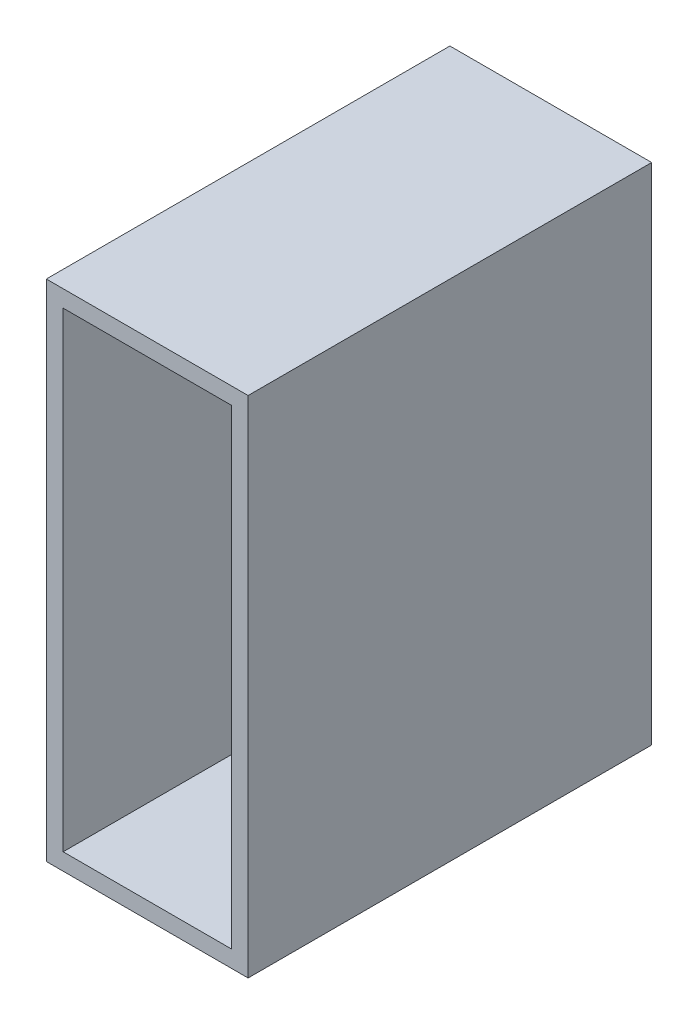
ISO-10303-21;
HEADER;
FILE_DESCRIPTION(('STEP AP214'),'2;1');
FILE_NAME('part.step','',(''),(''),'','','');
FILE_SCHEMA(('AUTOMOTIVE_DESIGN { 1 0 10303 214 1 1 1 1 }'));
ENDSEC;
DATA;
#1=APPLICATION_CONTEXT('core data for automotive mechanical design processes');
#2=APPLICATION_PROTOCOL_DEFINITION('international standard','automotive_design',2000,#1);
#3=PRODUCT_CONTEXT('',#1,'mechanical');
#4=PRODUCT('Part','Part','',(#3));
#5=PRODUCT_RELATED_PRODUCT_CATEGORY('part','',(#4));
#6=PRODUCT_DEFINITION_FORMATION('','',#4);
#7=PRODUCT_DEFINITION_CONTEXT('part definition',#1,'design');
#8=PRODUCT_DEFINITION('design','',#6,#7);
#9=PRODUCT_DEFINITION_SHAPE('','',#8);
#10=(LENGTH_UNIT() NAMED_UNIT(*) SI_UNIT(.MILLI.,.METRE.));
#11=(NAMED_UNIT(*) PLANE_ANGLE_UNIT() SI_UNIT($,.RADIAN.));
#12=(NAMED_UNIT(*) SI_UNIT($,.STERADIAN.) SOLID_ANGLE_UNIT());
#13=UNCERTAINTY_MEASURE_WITH_UNIT(LENGTH_MEASURE(1.E-05),#10,'distance_accuracy_value','');
#14=(GEOMETRIC_REPRESENTATION_CONTEXT(3) GLOBAL_UNCERTAINTY_ASSIGNED_CONTEXT((#13)) GLOBAL_UNIT_ASSIGNED_CONTEXT((#10,
#11,#12)) REPRESENTATION_CONTEXT('',''));
#15=CARTESIAN_POINT('',(0.,0.,0.));
#16=DIRECTION('',(0.,0.,1.));
#17=DIRECTION('',(1.,0.,0.));
#18=AXIS2_PLACEMENT_3D('',#15,#16,#17);
#19=CARTESIAN_POINT('',(0.,0.,48.));
#20=DIRECTION('',(0.,0.,-1.));
#21=DIRECTION('',(-1.,0.,0.));
#22=AXIS2_PLACEMENT_3D('',#19,#20,#21);
#23=PLANE('',#22);
#24=DIRECTION('',(0.,-1.,0.));
#25=VECTOR('',#24,1.);
#26=CARTESIAN_POINT('',(0.,0.,48.));
#27=LINE('',#26,#25);
#28=CARTESIAN_POINT('',(0.,60.,48.));
#29=VERTEX_POINT('',#28);
#30=CARTESIAN_POINT('',(0.,0.,48.));
#31=VERTEX_POINT('',#30);
#32=EDGE_CURVE('E144',#29,#31,#27,.T.);
#33=ORIENTED_EDGE('',*,*,#32,.T.);
#34=DIRECTION('',(1.,0.,0.));
#35=VECTOR('',#34,1.);
#36=CARTESIAN_POINT('',(0.,0.,48.));
#37=LINE('',#36,#35);
#38=CARTESIAN_POINT('',(24.,0.,48.));
#39=VERTEX_POINT('',#38);
#40=EDGE_CURVE('E146',#31,#39,#37,.T.);
#41=ORIENTED_EDGE('',*,*,#40,.T.);
#42=DIRECTION('',(0.,1.,0.));
#43=VECTOR('',#42,1.);
#44=CARTESIAN_POINT('',(24.,0.,48.));
#45=LINE('',#44,#43);
#46=CARTESIAN_POINT('',(24.,60.,48.));
#47=VERTEX_POINT('',#46);
#48=EDGE_CURVE('E151',#39,#47,#45,.T.);
#49=ORIENTED_EDGE('',*,*,#48,.T.);
#50=DIRECTION('',(-1.,0.,0.));
#51=VECTOR('',#50,1.);
#52=CARTESIAN_POINT('',(0.,60.,48.));
#53=LINE('',#52,#51);
#54=EDGE_CURVE('E153',#47,#29,#53,.T.);
#55=ORIENTED_EDGE('',*,*,#54,.T.);
#56=EDGE_LOOP('',(#33,#41,#49,#55));
#57=FACE_BOUND('',#56,.T.);
#58=DIRECTION('',(0.,-1.,0.));
#59=VECTOR('',#58,1.);
#60=CARTESIAN_POINT('',(2.,2.,48.));
#61=LINE('',#60,#59);
#62=CARTESIAN_POINT('',(2.,58.,48.));
#63=VERTEX_POINT('',#62);
#64=CARTESIAN_POINT('',(2.,2.,48.));
#65=VERTEX_POINT('',#64);
#66=EDGE_CURVE('E126',#63,#65,#61,.T.);
#67=ORIENTED_EDGE('',*,*,#66,.F.);
#68=DIRECTION('',(-1.,0.,0.));
#69=VECTOR('',#68,1.);
#70=CARTESIAN_POINT('',(2.,58.,48.));
#71=LINE('',#70,#69);
#72=CARTESIAN_POINT('',(22.,58.,48.));
#73=VERTEX_POINT('',#72);
#74=EDGE_CURVE('E117',#73,#63,#71,.T.);
#75=ORIENTED_EDGE('',*,*,#74,.F.);
#76=DIRECTION('',(0.,1.,0.));
#77=VECTOR('',#76,1.);
#78=CARTESIAN_POINT('',(22.,2.,48.));
#79=LINE('',#78,#77);
#80=CARTESIAN_POINT('',(22.,2.,48.));
#81=VERTEX_POINT('',#80);
#82=EDGE_CURVE('E137',#81,#73,#79,.T.);
#83=ORIENTED_EDGE('',*,*,#82,.F.);
#84=DIRECTION('',(1.,0.,0.));
#85=VECTOR('',#84,1.);
#86=CARTESIAN_POINT('',(2.,2.,48.));
#87=LINE('',#86,#85);
#88=EDGE_CURVE('E128',#65,#81,#87,.T.);
#89=ORIENTED_EDGE('',*,*,#88,.F.);
#90=EDGE_LOOP('',(#67,#75,#83,#89));
#91=FACE_BOUND('',#90,.T.);
#92=ADVANCED_FACE('F43',(#57,#91),#23,.F.);
#93=CARTESIAN_POINT('',(0.,0.,0.));
#94=DIRECTION('',(0.,0.,-1.));
#95=DIRECTION('',(-1.,0.,0.));
#96=AXIS2_PLACEMENT_3D('',#93,#94,#95);
#97=PLANE('',#96);
#98=DIRECTION('',(0.,-1.,0.));
#99=VECTOR('',#98,1.);
#100=CARTESIAN_POINT('',(0.,0.,0.));
#101=LINE('',#100,#99);
#102=CARTESIAN_POINT('',(0.,60.,0.));
#103=VERTEX_POINT('',#102);
#104=CARTESIAN_POINT('',(0.,0.,0.));
#105=VERTEX_POINT('',#104);
#106=EDGE_CURVE('E145',#103,#105,#101,.T.);
#107=ORIENTED_EDGE('',*,*,#106,.F.);
#108=DIRECTION('',(-1.,0.,0.));
#109=VECTOR('',#108,1.);
#110=CARTESIAN_POINT('',(0.,60.,0.));
#111=LINE('',#110,#109);
#112=CARTESIAN_POINT('',(24.,60.,0.));
#113=VERTEX_POINT('',#112);
#114=EDGE_CURVE('E149',#113,#103,#111,.T.);
#115=ORIENTED_EDGE('',*,*,#114,.F.);
#116=DIRECTION('',(0.,1.,0.));
#117=VECTOR('',#116,1.);
#118=CARTESIAN_POINT('',(24.,0.,0.));
#119=LINE('',#118,#117);
#120=CARTESIAN_POINT('',(24.,0.,0.));
#121=VERTEX_POINT('',#120);
#122=EDGE_CURVE('E159',#121,#113,#119,.T.);
#123=ORIENTED_EDGE('',*,*,#122,.F.);
#124=DIRECTION('',(1.,0.,0.));
#125=VECTOR('',#124,1.);
#126=CARTESIAN_POINT('',(0.,0.,0.));
#127=LINE('',#126,#125);
#128=EDGE_CURVE('E158',#105,#121,#127,.T.);
#129=ORIENTED_EDGE('',*,*,#128,.F.);
#130=EDGE_LOOP('',(#107,#115,#123,#129));
#131=FACE_BOUND('',#130,.T.);
#132=ADVANCED_FACE('F180',(#131),#97,.T.);
#133=CARTESIAN_POINT('',(0.,0.,48.));
#134=DIRECTION('',(1.,0.,0.));
#135=DIRECTION('',(0.,0.,-1.));
#136=AXIS2_PLACEMENT_3D('',#133,#134,#135);
#137=PLANE('',#136);
#138=ORIENTED_EDGE('',*,*,#106,.T.);
#139=DIRECTION('',(0.,0.,-1.));
#140=VECTOR('',#139,1.);
#141=CARTESIAN_POINT('',(0.,0.,48.));
#142=LINE('',#141,#140);
#143=EDGE_CURVE('E11',#31,#105,#142,.T.);
#144=ORIENTED_EDGE('',*,*,#143,.F.);
#145=ORIENTED_EDGE('',*,*,#32,.F.);
#146=DIRECTION('',(0.,0.,-1.));
#147=VECTOR('',#146,1.);
#148=CARTESIAN_POINT('',(0.,60.,48.));
#149=LINE('',#148,#147);
#150=EDGE_CURVE('E154',#29,#103,#149,.T.);
#151=ORIENTED_EDGE('',*,*,#150,.T.);
#152=EDGE_LOOP('',(#138,#144,#145,#151));
#153=FACE_BOUND('',#152,.T.);
#154=ADVANCED_FACE('F44',(#153),#137,.F.);
#155=CARTESIAN_POINT('',(0.,0.,48.));
#156=DIRECTION('',(0.,1.,0.));
#157=DIRECTION('',(0.,0.,1.));
#158=AXIS2_PLACEMENT_3D('',#155,#156,#157);
#159=PLANE('',#158);
#160=ORIENTED_EDGE('',*,*,#128,.T.);
#161=DIRECTION('',(0.,0.,-1.));
#162=VECTOR('',#161,1.);
#163=CARTESIAN_POINT('',(24.,0.,48.));
#164=LINE('',#163,#162);
#165=EDGE_CURVE('E51',#39,#121,#164,.T.);
#166=ORIENTED_EDGE('',*,*,#165,.F.);
#167=ORIENTED_EDGE('',*,*,#40,.F.);
#168=ORIENTED_EDGE('',*,*,#143,.T.);
#169=EDGE_LOOP('',(#160,#166,#167,#168));
#170=FACE_BOUND('',#169,.T.);
#171=ADVANCED_FACE('F189',(#170),#159,.F.);
#172=CARTESIAN_POINT('',(24.,0.,48.));
#173=DIRECTION('',(-1.,0.,0.));
#174=DIRECTION('',(0.,0.,1.));
#175=AXIS2_PLACEMENT_3D('',#172,#173,#174);
#176=PLANE('',#175);
#177=ORIENTED_EDGE('',*,*,#122,.T.);
#178=DIRECTION('',(0.,0.,-1.));
#179=VECTOR('',#178,1.);
#180=CARTESIAN_POINT('',(24.,60.,48.));
#181=LINE('',#180,#179);
#182=EDGE_CURVE('E164',#47,#113,#181,.T.);
#183=ORIENTED_EDGE('',*,*,#182,.F.);
#184=ORIENTED_EDGE('',*,*,#48,.F.);
#185=ORIENTED_EDGE('',*,*,#165,.T.);
#186=EDGE_LOOP('',(#177,#183,#184,#185));
#187=FACE_BOUND('',#186,.T.);
#188=ADVANCED_FACE('F175',(#187),#176,.F.);
#189=CARTESIAN_POINT('',(0.,60.,48.));
#190=DIRECTION('',(0.,-1.,0.));
#191=DIRECTION('',(0.,0.,-1.));
#192=AXIS2_PLACEMENT_3D('',#189,#190,#191);
#193=PLANE('',#192);
#194=ORIENTED_EDGE('',*,*,#114,.T.);
#195=ORIENTED_EDGE('',*,*,#150,.F.);
#196=ORIENTED_EDGE('',*,*,#54,.F.);
#197=ORIENTED_EDGE('',*,*,#182,.T.);
#198=EDGE_LOOP('',(#194,#195,#196,#197));
#199=FACE_BOUND('',#198,.T.);
#200=ADVANCED_FACE('F182',(#199),#193,.F.);
#201=CARTESIAN_POINT('',(2.,2.,48.));
#202=DIRECTION('',(1.,0.,0.));
#203=DIRECTION('',(0.,0.,-1.));
#204=AXIS2_PLACEMENT_3D('',#201,#202,#203);
#205=PLANE('',#204);
#206=DIRECTION('',(0.,-1.,0.));
#207=VECTOR('',#206,1.);
#208=CARTESIAN_POINT('',(2.,2.,2.));
#209=LINE('',#208,#207);
#210=CARTESIAN_POINT('',(2.,58.,2.));
#211=VERTEX_POINT('',#210);
#212=CARTESIAN_POINT('',(2.,2.,2.));
#213=VERTEX_POINT('',#212);
#214=EDGE_CURVE('E124',#211,#213,#209,.T.);
#215=ORIENTED_EDGE('',*,*,#214,.F.);
#216=DIRECTION('',(0.,0.,-1.));
#217=VECTOR('',#216,1.);
#218=CARTESIAN_POINT('',(2.,58.,48.));
#219=LINE('',#218,#217);
#220=EDGE_CURVE('E109',#63,#211,#219,.T.);
#221=ORIENTED_EDGE('',*,*,#220,.F.);
#222=ORIENTED_EDGE('',*,*,#66,.T.);
#223=DIRECTION('',(0.,0.,-1.));
#224=VECTOR('',#223,1.);
#225=CARTESIAN_POINT('',(2.,2.,48.));
#226=LINE('',#225,#224);
#227=EDGE_CURVE('E121',#65,#213,#226,.T.);
#228=ORIENTED_EDGE('',*,*,#227,.T.);
#229=EDGE_LOOP('',(#215,#221,#222,#228));
#230=FACE_BOUND('',#229,.T.);
#231=ADVANCED_FACE('F125',(#230),#205,.T.);
#232=CARTESIAN_POINT('',(2.,2.,48.));
#233=DIRECTION('',(0.,1.,0.));
#234=DIRECTION('',(0.,0.,1.));
#235=AXIS2_PLACEMENT_3D('',#232,#233,#234);
#236=PLANE('',#235);
#237=DIRECTION('',(1.,0.,0.));
#238=VECTOR('',#237,1.);
#239=CARTESIAN_POINT('',(2.,2.,2.));
#240=LINE('',#239,#238);
#241=CARTESIAN_POINT('',(22.,2.,2.));
#242=VERTEX_POINT('',#241);
#243=EDGE_CURVE('E59',#213,#242,#240,.T.);
#244=ORIENTED_EDGE('',*,*,#243,.F.);
#245=ORIENTED_EDGE('',*,*,#227,.F.);
#246=ORIENTED_EDGE('',*,*,#88,.T.);
#247=DIRECTION('',(0.,0.,-1.));
#248=VECTOR('',#247,1.);
#249=CARTESIAN_POINT('',(22.,2.,48.));
#250=LINE('',#249,#248);
#251=EDGE_CURVE('E143',#81,#242,#250,.T.);
#252=ORIENTED_EDGE('',*,*,#251,.T.);
#253=EDGE_LOOP('',(#244,#245,#246,#252));
#254=FACE_BOUND('',#253,.T.);
#255=ADVANCED_FACE('F208',(#254),#236,.T.);
#256=CARTESIAN_POINT('',(22.,2.,48.));
#257=DIRECTION('',(-1.,0.,0.));
#258=DIRECTION('',(0.,0.,1.));
#259=AXIS2_PLACEMENT_3D('',#256,#257,#258);
#260=PLANE('',#259);
#261=DIRECTION('',(0.,1.,0.));
#262=VECTOR('',#261,1.);
#263=CARTESIAN_POINT('',(22.,2.,2.));
#264=LINE('',#263,#262);
#265=CARTESIAN_POINT('',(22.,58.,2.));
#266=VERTEX_POINT('',#265);
#267=EDGE_CURVE('E67',#242,#266,#264,.T.);
#268=ORIENTED_EDGE('',*,*,#267,.F.);
#269=ORIENTED_EDGE('',*,*,#251,.F.);
#270=ORIENTED_EDGE('',*,*,#82,.T.);
#271=DIRECTION('',(0.,0.,-1.));
#272=VECTOR('',#271,1.);
#273=CARTESIAN_POINT('',(22.,58.,48.));
#274=LINE('',#273,#272);
#275=EDGE_CURVE('E116',#73,#266,#274,.T.);
#276=ORIENTED_EDGE('',*,*,#275,.T.);
#277=EDGE_LOOP('',(#268,#269,#270,#276));
#278=FACE_BOUND('',#277,.T.);
#279=ADVANCED_FACE('F215',(#278),#260,.T.);
#280=CARTESIAN_POINT('',(2.,58.,48.));
#281=DIRECTION('',(0.,-1.,0.));
#282=DIRECTION('',(0.,0.,-1.));
#283=AXIS2_PLACEMENT_3D('',#280,#281,#282);
#284=PLANE('',#283);
#285=DIRECTION('',(-1.,0.,0.));
#286=VECTOR('',#285,1.);
#287=CARTESIAN_POINT('',(2.,58.,2.));
#288=LINE('',#287,#286);
#289=EDGE_CURVE('E111',#266,#211,#288,.T.);
#290=ORIENTED_EDGE('',*,*,#289,.F.);
#291=ORIENTED_EDGE('',*,*,#275,.F.);
#292=ORIENTED_EDGE('',*,*,#74,.T.);
#293=ORIENTED_EDGE('',*,*,#220,.T.);
#294=EDGE_LOOP('',(#290,#291,#292,#293));
#295=FACE_BOUND('',#294,.T.);
#296=ADVANCED_FACE('F115',(#295),#284,.T.);
#297=CARTESIAN_POINT('',(0.,0.,2.));
#298=DIRECTION('',(0.,0.,-1.));
#299=DIRECTION('',(-1.,0.,0.));
#300=AXIS2_PLACEMENT_3D('',#297,#298,#299);
#301=PLANE('',#300);
#302=ORIENTED_EDGE('',*,*,#214,.T.);
#303=ORIENTED_EDGE('',*,*,#243,.T.);
#304=ORIENTED_EDGE('',*,*,#267,.T.);
#305=ORIENTED_EDGE('',*,*,#289,.T.);
#306=EDGE_LOOP('',(#302,#303,#304,#305));
#307=FACE_BOUND('',#306,.T.);
#308=ADVANCED_FACE('F130',(#307),#301,.F.);
#309=CLOSED_SHELL('',(#92,#132,#154,#171,#188,#200,#231,#255,#279,#296,#308));
#310=MANIFOLD_SOLID_BREP('B2',#309);
#311=ADVANCED_BREP_SHAPE_REPRESENTATION('',(#18,#310),#14);
#312=SHAPE_DEFINITION_REPRESENTATION(#9,#311);
ENDSEC;
END-ISO-10303-21;
